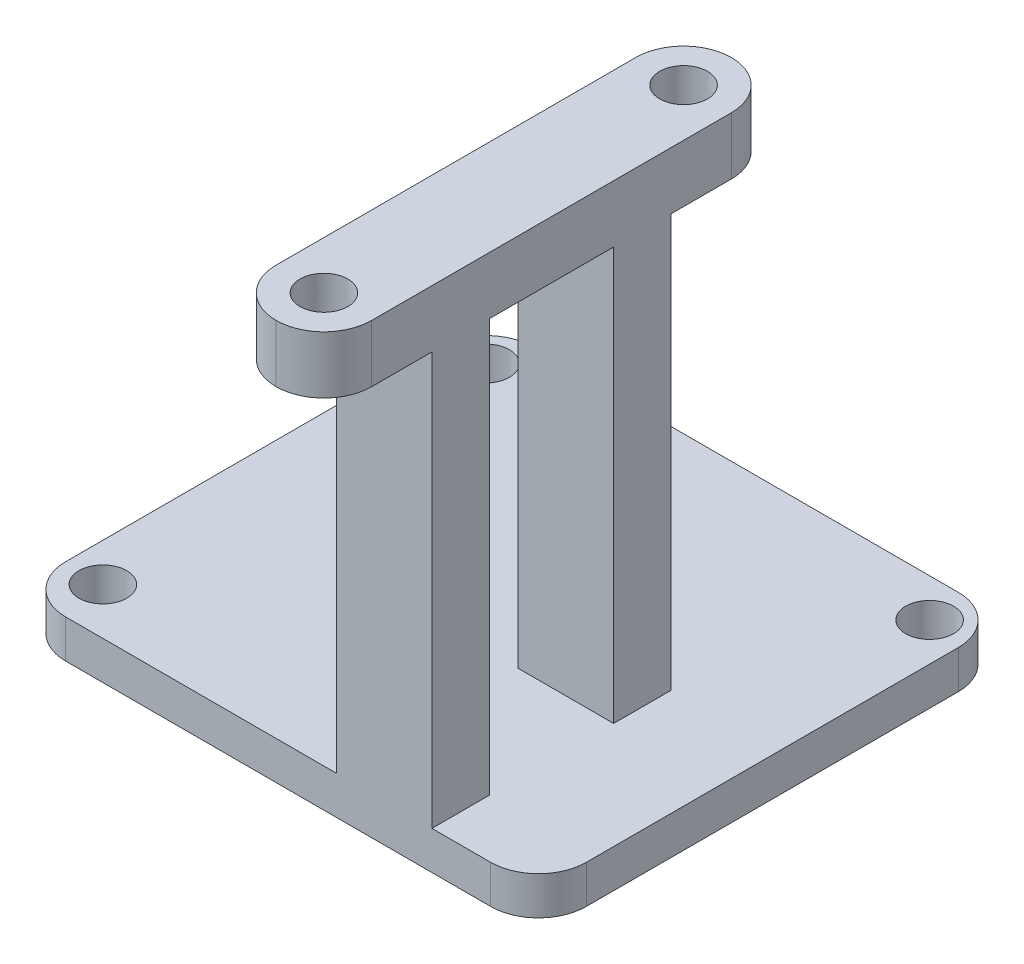
ISO-10303-21;
HEADER;
FILE_DESCRIPTION(('STEP AP214'),'2;1');
FILE_NAME('part.step','',(''),(''),'','','');
FILE_SCHEMA(('AUTOMOTIVE_DESIGN { 1 0 10303 214 1 1 1 1 }'));
ENDSEC;
DATA;
#1=APPLICATION_CONTEXT('core data for automotive mechanical design processes');
#2=APPLICATION_PROTOCOL_DEFINITION('international standard','automotive_design',2000,#1);
#3=PRODUCT_CONTEXT('',#1,'mechanical');
#4=PRODUCT('Part','Part','',(#3));
#5=PRODUCT_RELATED_PRODUCT_CATEGORY('part','',(#4));
#6=PRODUCT_DEFINITION_FORMATION('','',#4);
#7=PRODUCT_DEFINITION_CONTEXT('part definition',#1,'design');
#8=PRODUCT_DEFINITION('design','',#6,#7);
#9=PRODUCT_DEFINITION_SHAPE('','',#8);
#10=(LENGTH_UNIT() NAMED_UNIT(*) SI_UNIT(.MILLI.,.METRE.));
#11=(NAMED_UNIT(*) PLANE_ANGLE_UNIT() SI_UNIT($,.RADIAN.));
#12=(NAMED_UNIT(*) SI_UNIT($,.STERADIAN.) SOLID_ANGLE_UNIT());
#13=UNCERTAINTY_MEASURE_WITH_UNIT(LENGTH_MEASURE(1.E-05),#10,'distance_accuracy_value','');
#14=(GEOMETRIC_REPRESENTATION_CONTEXT(3) GLOBAL_UNCERTAINTY_ASSIGNED_CONTEXT((#13)) GLOBAL_UNIT_ASSIGNED_CONTEXT((#10,
#11,#12)) REPRESENTATION_CONTEXT('',''));
#15=CARTESIAN_POINT('',(0.,0.,0.));
#16=DIRECTION('',(0.,0.,1.));
#17=DIRECTION('',(1.,0.,0.));
#18=AXIS2_PLACEMENT_3D('',#15,#16,#17);
#19=CARTESIAN_POINT('',(-69.1242966,5.08,0.));
#20=DIRECTION('',(0.,-1.,0.));
#21=DIRECTION('',(0.,0.,-1.));
#22=AXIS2_PLACEMENT_3D('',#19,#20,#21);
#23=PLANE('',#22);
#24=DIRECTION('',(0.,0.,1.));
#25=VECTOR('',#24,1.);
#26=CARTESIAN_POINT('',(-61.4135805,5.08,0.));
#27=LINE('',#26,#25);
#28=CARTESIAN_POINT('',(-61.4135805,5.08,-0.706390719495832));
#29=VERTEX_POINT('',#28);
#30=CARTESIAN_POINT('',(-61.4135805,5.08,6.91360928050417));
#31=VERTEX_POINT('',#30);
#32=EDGE_CURVE('E225',#29,#31,#27,.T.);
#33=ORIENTED_EDGE('',*,*,#32,.F.);
#34=DIRECTION('',(1.,0.,0.));
#35=VECTOR('',#34,1.);
#36=CARTESIAN_POINT('',(-61.4135805,5.08,-0.706390719495832));
#37=LINE('',#36,#35);
#38=CARTESIAN_POINT('',(-48.7135805,5.08,-0.706390719495832));
#39=VERTEX_POINT('',#38);
#40=EDGE_CURVE('E219',#29,#39,#37,.T.);
#41=ORIENTED_EDGE('',*,*,#40,.T.);
#42=DIRECTION('',(0.,0.,1.));
#43=VECTOR('',#42,1.);
#44=CARTESIAN_POINT('',(-48.7135805,5.08,0.));
#45=LINE('',#44,#43);
#46=CARTESIAN_POINT('',(-48.7135805,5.08,6.91360928050417));
#47=VERTEX_POINT('',#46);
#48=EDGE_CURVE('E258',#39,#47,#45,.T.);
#49=ORIENTED_EDGE('',*,*,#48,.T.);
#50=DIRECTION('',(1.,0.,0.));
#51=VECTOR('',#50,1.);
#52=CARTESIAN_POINT('',(-61.4135805,5.08,6.91360928050417));
#53=LINE('',#52,#51);
#54=EDGE_CURVE('E294',#31,#47,#53,.T.);
#55=ORIENTED_EDGE('',*,*,#54,.F.);
#56=EDGE_LOOP('',(#33,#41,#49,#55));
#57=FACE_BOUND('',#56,.T.);
#58=CARTESIAN_POINT('',(-39.6421483,5.08,-25.9636092805042));
#59=DIRECTION('',(0.,-1.,0.));
#60=DIRECTION('',(0.,0.,1.));
#61=AXIS2_PLACEMENT_3D('',#58,#59,#60);
#62=CIRCLE('',#61,3.17499999999997);
#63=CARTESIAN_POINT('',(-39.6421483,5.08,-22.7886092805042));
#64=VERTEX_POINT('',#63);
#65=EDGE_CURVE('E316',#64,#64,#62,.T.);
#66=ORIENTED_EDGE('',*,*,#65,.T.);
#67=EDGE_LOOP('',(#66));
#68=FACE_BOUND('',#67,.T.);
#69=CARTESIAN_POINT('',(-98.6064449,5.08,-25.963609280505));
#70=DIRECTION('',(0.,-1.,0.));
#71=DIRECTION('',(0.,0.,1.));
#72=AXIS2_PLACEMENT_3D('',#69,#70,#71);
#73=CIRCLE('',#72,3.17499999999997);
#74=CARTESIAN_POINT('',(-98.6064449,5.08,-22.788609280505));
#75=VERTEX_POINT('',#74);
#76=EDGE_CURVE('E308',#75,#75,#73,.T.);
#77=ORIENTED_EDGE('',*,*,#76,.T.);
#78=EDGE_LOOP('',(#77));
#79=FACE_BOUND('',#78,.T.);
#80=CARTESIAN_POINT('',(-98.6064449000012,5.08,24.836390719495));
#81=DIRECTION('',(0.,-1.,0.));
#82=DIRECTION('',(0.,0.,1.));
#83=AXIS2_PLACEMENT_3D('',#80,#81,#82);
#84=CIRCLE('',#83,3.17499999999997);
#85=CARTESIAN_POINT('',(-98.6064449000012,5.08,28.011390719495));
#86=VERTEX_POINT('',#85);
#87=EDGE_CURVE('E300',#86,#86,#84,.T.);
#88=ORIENTED_EDGE('',*,*,#87,.T.);
#89=EDGE_LOOP('',(#88));
#90=FACE_BOUND('',#89,.T.);
#91=DIRECTION('',(0.,0.,-1.));
#92=VECTOR('',#91,1.);
#93=CARTESIAN_POINT('',(-103.6864449,5.08,-31.0436092805042));
#94=LINE('',#93,#92);
#95=CARTESIAN_POINT('',(-103.6864449,5.08,24.6936092805042));
#96=VERTEX_POINT('',#95);
#97=CARTESIAN_POINT('',(-103.6864449,5.08,-24.6936092805042));
#98=VERTEX_POINT('',#97);
#99=EDGE_CURVE('E334',#96,#98,#94,.T.);
#100=ORIENTED_EDGE('',*,*,#99,.F.);
#101=CARTESIAN_POINT('',(-97.3364449,5.08,24.6936092805042));
#102=DIRECTION('',(0.,1.,0.));
#103=DIRECTION('',(0.,0.,-1.));
#104=AXIS2_PLACEMENT_3D('',#101,#102,#103);
#105=CIRCLE('',#104,6.35);
#106=CARTESIAN_POINT('',(-97.3364449,5.08,31.0436092805042));
#107=VERTEX_POINT('',#106);
#108=EDGE_CURVE('E392',#107,#96,#105,.F.);
#109=ORIENTED_EDGE('',*,*,#108,.F.);
#110=DIRECTION('',(-1.,0.,0.));
#111=VECTOR('',#110,1.);
#112=CARTESIAN_POINT('',(-103.6864449,5.08,31.0436092805042));
#113=LINE('',#112,#111);
#114=CARTESIAN_POINT('',(-61.4135805,5.08,31.0436092805042));
#115=VERTEX_POINT('',#114);
#116=EDGE_CURVE('E328',#115,#107,#113,.T.);
#117=ORIENTED_EDGE('',*,*,#116,.F.);
#118=DIRECTION('',(0.,0.,-1.));
#119=VECTOR('',#118,1.);
#120=CARTESIAN_POINT('',(-61.4135805,5.08,0.));
#121=LINE('',#120,#119);
#122=CARTESIAN_POINT('',(-61.4135805,5.08,23.4236092805042));
#123=VERTEX_POINT('',#122);
#124=EDGE_CURVE('E238',#115,#123,#121,.T.);
#125=ORIENTED_EDGE('',*,*,#124,.T.);
#126=DIRECTION('',(1.,0.,0.));
#127=VECTOR('',#126,1.);
#128=CARTESIAN_POINT('',(-61.4135805,5.08,23.4236092805042));
#129=LINE('',#128,#127);
#130=CARTESIAN_POINT('',(-48.7135805,5.08,23.4236092805042));
#131=VERTEX_POINT('',#130);
#132=EDGE_CURVE('E282',#123,#131,#129,.T.);
#133=ORIENTED_EDGE('',*,*,#132,.T.);
#134=DIRECTION('',(0.,0.,-1.));
#135=VECTOR('',#134,1.);
#136=CARTESIAN_POINT('',(-48.7135805,5.08,0.));
#137=LINE('',#136,#135);
#138=CARTESIAN_POINT('',(-48.7135805,5.08,31.0436092805042));
#139=VERTEX_POINT('',#138);
#140=EDGE_CURVE('E269',#139,#131,#137,.T.);
#141=ORIENTED_EDGE('',*,*,#140,.F.);
#142=CARTESIAN_POINT('',(-40.9121483,5.08,31.0436092805042));
#143=VERTEX_POINT('',#142);
#144=EDGE_CURVE('E330',#143,#139,#113,.T.);
#145=ORIENTED_EDGE('',*,*,#144,.F.);
#146=CARTESIAN_POINT('',(-40.9121483,5.08,24.6936092805042));
#147=DIRECTION('',(0.,1.,0.));
#148=DIRECTION('',(0.,0.,-1.));
#149=AXIS2_PLACEMENT_3D('',#146,#147,#148);
#150=CIRCLE('',#149,6.35);
#151=CARTESIAN_POINT('',(-34.5621483,5.08,24.6936092805042));
#152=VERTEX_POINT('',#151);
#153=EDGE_CURVE('E388',#152,#143,#150,.F.);
#154=ORIENTED_EDGE('',*,*,#153,.F.);
#155=DIRECTION('',(0.,0.,1.));
#156=VECTOR('',#155,1.);
#157=CARTESIAN_POINT('',(-34.5621483,5.08,-31.0436092805042));
#158=LINE('',#157,#156);
#159=CARTESIAN_POINT('',(-34.5621483,5.08,-24.6936092805042));
#160=VERTEX_POINT('',#159);
#161=EDGE_CURVE('E324',#160,#152,#158,.T.);
#162=ORIENTED_EDGE('',*,*,#161,.F.);
#163=CARTESIAN_POINT('',(-40.9121483,5.08,-24.6936092805042));
#164=DIRECTION('',(0.,1.,0.));
#165=DIRECTION('',(0.,0.,-1.));
#166=AXIS2_PLACEMENT_3D('',#163,#164,#165);
#167=CIRCLE('',#166,6.35);
#168=CARTESIAN_POINT('',(-40.9121483,5.08,-31.0436092805042));
#169=VERTEX_POINT('',#168);
#170=EDGE_CURVE('E384',#169,#160,#167,.F.);
#171=ORIENTED_EDGE('',*,*,#170,.F.);
#172=DIRECTION('',(1.,0.,0.));
#173=VECTOR('',#172,1.);
#174=CARTESIAN_POINT('',(-103.6864449,5.08,-31.0436092805042));
#175=LINE('',#174,#173);
#176=CARTESIAN_POINT('',(-97.3364449,5.08,-31.0436092805042));
#177=VERTEX_POINT('',#176);
#178=EDGE_CURVE('E338',#177,#169,#175,.T.);
#179=ORIENTED_EDGE('',*,*,#178,.F.);
#180=CARTESIAN_POINT('',(-97.3364449,5.08,-24.6936092805042));
#181=DIRECTION('',(0.,1.,0.));
#182=DIRECTION('',(0.,0.,-1.));
#183=AXIS2_PLACEMENT_3D('',#180,#181,#182);
#184=CIRCLE('',#183,6.35);
#185=EDGE_CURVE('E396',#98,#177,#184,.F.);
#186=ORIENTED_EDGE('',*,*,#185,.F.);
#187=EDGE_LOOP('',(#100,#109,#117,#125,#133,#141,#145,#154,#162,#171,#179,#186));
#188=FACE_BOUND('',#187,.T.);
#189=ADVANCED_FACE('F49',(#57,#68,#79,#90,#188),#23,.F.);
#190=CARTESIAN_POINT('',(-69.1242966,0.,0.));
#191=DIRECTION('',(0.,-1.,0.));
#192=DIRECTION('',(0.,0.,-1.));
#193=AXIS2_PLACEMENT_3D('',#190,#191,#192);
#194=PLANE('',#193);
#195=CARTESIAN_POINT('',(-98.6064449,0.,-25.963609280505));
#196=DIRECTION('',(0.,-1.,0.));
#197=DIRECTION('',(0.,0.,1.));
#198=AXIS2_PLACEMENT_3D('',#195,#196,#197);
#199=CIRCLE('',#198,3.17499999999997);
#200=CARTESIAN_POINT('',(-98.6064449,0.,-22.788609280505));
#201=VERTEX_POINT('',#200);
#202=EDGE_CURVE('E304',#201,#201,#199,.T.);
#203=ORIENTED_EDGE('',*,*,#202,.F.);
#204=EDGE_LOOP('',(#203));
#205=FACE_BOUND('',#204,.T.);
#206=DIRECTION('',(1.,0.,0.));
#207=VECTOR('',#206,1.);
#208=CARTESIAN_POINT('',(-103.6864449,0.,-31.0436092805042));
#209=LINE('',#208,#207);
#210=CARTESIAN_POINT('',(-97.3364449,0.,-31.0436092805042));
#211=VERTEX_POINT('',#210);
#212=CARTESIAN_POINT('',(-40.9121483,0.,-31.0436092805042));
#213=VERTEX_POINT('',#212);
#214=EDGE_CURVE('E329',#211,#213,#209,.T.);
#215=ORIENTED_EDGE('',*,*,#214,.T.);
#216=CARTESIAN_POINT('',(-40.9121483,0.,-24.6936092805042));
#217=DIRECTION('',(0.,1.,0.));
#218=DIRECTION('',(0.,0.,-1.));
#219=AXIS2_PLACEMENT_3D('',#216,#217,#218);
#220=CIRCLE('',#219,6.35);
#221=CARTESIAN_POINT('',(-34.5621483,0.,-24.6936092805042));
#222=VERTEX_POINT('',#221);
#223=EDGE_CURVE('E362',#222,#213,#220,.T.);
#224=ORIENTED_EDGE('',*,*,#223,.F.);
#225=DIRECTION('',(0.,0.,1.));
#226=VECTOR('',#225,1.);
#227=CARTESIAN_POINT('',(-34.5621483,0.,-31.0436092805042));
#228=LINE('',#227,#226);
#229=CARTESIAN_POINT('',(-34.5621483,0.,24.6936092805042));
#230=VERTEX_POINT('',#229);
#231=EDGE_CURVE('E320',#222,#230,#228,.T.);
#232=ORIENTED_EDGE('',*,*,#231,.T.);
#233=CARTESIAN_POINT('',(-40.9121483,0.,24.6936092805042));
#234=DIRECTION('',(0.,1.,0.));
#235=DIRECTION('',(0.,0.,-1.));
#236=AXIS2_PLACEMENT_3D('',#233,#234,#235);
#237=CIRCLE('',#236,6.35);
#238=CARTESIAN_POINT('',(-40.9121483,0.,31.0436092805042));
#239=VERTEX_POINT('',#238);
#240=EDGE_CURVE('E366',#239,#230,#237,.T.);
#241=ORIENTED_EDGE('',*,*,#240,.F.);
#242=DIRECTION('',(-1.,0.,0.));
#243=VECTOR('',#242,1.);
#244=CARTESIAN_POINT('',(-103.6864449,0.,31.0436092805042));
#245=LINE('',#244,#243);
#246=CARTESIAN_POINT('',(-97.3364449,0.,31.0436092805042));
#247=VERTEX_POINT('',#246);
#248=EDGE_CURVE('E346',#239,#247,#245,.T.);
#249=ORIENTED_EDGE('',*,*,#248,.T.);
#250=CARTESIAN_POINT('',(-97.3364449,0.,24.6936092805042));
#251=DIRECTION('',(0.,1.,0.));
#252=DIRECTION('',(0.,0.,-1.));
#253=AXIS2_PLACEMENT_3D('',#250,#251,#252);
#254=CIRCLE('',#253,6.35);
#255=CARTESIAN_POINT('',(-103.6864449,0.,24.6936092805042));
#256=VERTEX_POINT('',#255);
#257=EDGE_CURVE('E370',#256,#247,#254,.T.);
#258=ORIENTED_EDGE('',*,*,#257,.F.);
#259=DIRECTION('',(0.,0.,-1.));
#260=VECTOR('',#259,1.);
#261=CARTESIAN_POINT('',(-103.6864449,0.,-31.0436092805042));
#262=LINE('',#261,#260);
#263=CARTESIAN_POINT('',(-103.6864449,0.,-24.6936092805042));
#264=VERTEX_POINT('',#263);
#265=EDGE_CURVE('E350',#256,#264,#262,.T.);
#266=ORIENTED_EDGE('',*,*,#265,.T.);
#267=CARTESIAN_POINT('',(-97.3364449,0.,-24.6936092805042));
#268=DIRECTION('',(0.,1.,0.));
#269=DIRECTION('',(0.,0.,-1.));
#270=AXIS2_PLACEMENT_3D('',#267,#268,#269);
#271=CIRCLE('',#270,6.35);
#272=EDGE_CURVE('E374',#211,#264,#271,.T.);
#273=ORIENTED_EDGE('',*,*,#272,.F.);
#274=EDGE_LOOP('',(#215,#224,#232,#241,#249,#258,#266,#273));
#275=FACE_BOUND('',#274,.T.);
#276=CARTESIAN_POINT('',(-39.6421483,0.,-25.9636092805042));
#277=DIRECTION('',(0.,-1.,0.));
#278=DIRECTION('',(0.,0.,1.));
#279=AXIS2_PLACEMENT_3D('',#276,#277,#278);
#280=CIRCLE('',#279,3.17499999999997);
#281=CARTESIAN_POINT('',(-39.6421483,0.,-22.7886092805042));
#282=VERTEX_POINT('',#281);
#283=EDGE_CURVE('E312',#282,#282,#280,.T.);
#284=ORIENTED_EDGE('',*,*,#283,.F.);
#285=EDGE_LOOP('',(#284));
#286=FACE_BOUND('',#285,.T.);
#287=CARTESIAN_POINT('',(-98.6064449000012,0.,24.836390719495));
#288=DIRECTION('',(0.,-1.,0.));
#289=DIRECTION('',(0.,0.,1.));
#290=AXIS2_PLACEMENT_3D('',#287,#288,#289);
#291=CIRCLE('',#290,3.17499999999997);
#292=CARTESIAN_POINT('',(-98.6064449000012,0.,28.011390719495));
#293=VERTEX_POINT('',#292);
#294=EDGE_CURVE('E281',#293,#293,#291,.T.);
#295=ORIENTED_EDGE('',*,*,#294,.F.);
#296=EDGE_LOOP('',(#295));
#297=FACE_BOUND('',#296,.T.);
#298=ADVANCED_FACE('F520',(#205,#275,#286,#297),#194,.T.);
#299=CARTESIAN_POINT('',(-34.5621483,5.08,-31.0436092805042));
#300=DIRECTION('',(-1.,0.,0.));
#301=DIRECTION('',(0.,0.,-1.));
#302=AXIS2_PLACEMENT_3D('',#299,#300,#301);
#303=PLANE('',#302);
#304=ORIENTED_EDGE('',*,*,#231,.F.);
#305=DIRECTION('',(0.,-1.,0.));
#306=VECTOR('',#305,1.);
#307=CARTESIAN_POINT('',(-34.5621483,5.08,-24.6936092805042));
#308=LINE('',#307,#306);
#309=EDGE_CURVE('E406',#160,#222,#308,.T.);
#310=ORIENTED_EDGE('',*,*,#309,.F.);
#311=ORIENTED_EDGE('',*,*,#161,.T.);
#312=DIRECTION('',(0.,-1.,0.));
#313=VECTOR('',#312,1.);
#314=CARTESIAN_POINT('',(-34.5621483,5.08,24.6936092805042));
#315=LINE('',#314,#313);
#316=EDGE_CURVE('E409',#230,#152,#315,.F.);
#317=ORIENTED_EDGE('',*,*,#316,.F.);
#318=EDGE_LOOP('',(#304,#310,#311,#317));
#319=FACE_BOUND('',#318,.T.);
#320=ADVANCED_FACE('F526',(#319),#303,.F.);
#321=CARTESIAN_POINT('',(-103.6864449,5.08,31.0436092805042));
#322=DIRECTION('',(0.,0.,-1.));
#323=DIRECTION('',(1.,0.,0.));
#324=AXIS2_PLACEMENT_3D('',#321,#322,#323);
#325=PLANE('',#324);
#326=ORIENTED_EDGE('',*,*,#248,.F.);
#327=DIRECTION('',(0.,-1.,0.));
#328=VECTOR('',#327,1.);
#329=CARTESIAN_POINT('',(-40.9121483,5.08,31.0436092805042));
#330=LINE('',#329,#328);
#331=EDGE_CURVE('E400',#143,#239,#330,.T.);
#332=ORIENTED_EDGE('',*,*,#331,.F.);
#333=ORIENTED_EDGE('',*,*,#144,.T.);
#334=DIRECTION('',(0.,1.,0.));
#335=VECTOR('',#334,1.);
#336=CARTESIAN_POINT('',(-48.7135805,0.,31.0436092805042));
#337=LINE('',#336,#335);
#338=CARTESIAN_POINT('',(-48.7135805,59.8643964,31.0436092805042));
#339=VERTEX_POINT('',#338);
#340=EDGE_CURVE('E273',#139,#339,#337,.T.);
#341=ORIENTED_EDGE('',*,*,#340,.T.);
#342=DIRECTION('',(1.,0.,0.));
#343=VECTOR('',#342,1.);
#344=CARTESIAN_POINT('',(-61.4135805,59.8643964,31.0436092805042));
#345=LINE('',#344,#343);
#346=CARTESIAN_POINT('',(-61.4135805,59.8643964,31.0436092805042));
#347=VERTEX_POINT('',#346);
#348=EDGE_CURVE('E277',#347,#339,#345,.T.);
#349=ORIENTED_EDGE('',*,*,#348,.F.);
#350=DIRECTION('',(0.,1.,0.));
#351=VECTOR('',#350,1.);
#352=CARTESIAN_POINT('',(-61.4135805,0.,31.0436092805042));
#353=LINE('',#352,#351);
#354=EDGE_CURVE('E242',#115,#347,#353,.T.);
#355=ORIENTED_EDGE('',*,*,#354,.F.);
#356=ORIENTED_EDGE('',*,*,#116,.T.);
#357=DIRECTION('',(0.,-1.,0.));
#358=VECTOR('',#357,1.);
#359=CARTESIAN_POINT('',(-97.3364449,5.08,31.0436092805042));
#360=LINE('',#359,#358);
#361=EDGE_CURVE('E403',#247,#107,#360,.F.);
#362=ORIENTED_EDGE('',*,*,#361,.F.);
#363=EDGE_LOOP('',(#326,#332,#333,#341,#349,#355,#356,#362));
#364=FACE_BOUND('',#363,.T.);
#365=ADVANCED_FACE('F541',(#364),#325,.F.);
#366=CARTESIAN_POINT('',(-103.6864449,5.08,-31.0436092805042));
#367=DIRECTION('',(1.,0.,0.));
#368=DIRECTION('',(0.,0.,1.));
#369=AXIS2_PLACEMENT_3D('',#366,#367,#368);
#370=PLANE('',#369);
#371=ORIENTED_EDGE('',*,*,#265,.F.);
#372=DIRECTION('',(0.,-1.,0.));
#373=VECTOR('',#372,1.);
#374=CARTESIAN_POINT('',(-103.6864449,5.08,24.6936092805042));
#375=LINE('',#374,#373);
#376=EDGE_CURVE('E378',#96,#256,#375,.T.);
#377=ORIENTED_EDGE('',*,*,#376,.F.);
#378=ORIENTED_EDGE('',*,*,#99,.T.);
#379=DIRECTION('',(0.,-1.,0.));
#380=VECTOR('',#379,1.);
#381=CARTESIAN_POINT('',(-103.6864449,5.08,-24.6936092805042));
#382=LINE('',#381,#380);
#383=EDGE_CURVE('E381',#264,#98,#382,.F.);
#384=ORIENTED_EDGE('',*,*,#383,.F.);
#385=EDGE_LOOP('',(#371,#377,#378,#384));
#386=FACE_BOUND('',#385,.T.);
#387=ADVANCED_FACE('F537',(#386),#370,.F.);
#388=CARTESIAN_POINT('',(-103.6864449,5.08,-31.0436092805042));
#389=DIRECTION('',(0.,0.,1.));
#390=DIRECTION('',(-1.,0.,0.));
#391=AXIS2_PLACEMENT_3D('',#388,#389,#390);
#392=PLANE('',#391);
#393=ORIENTED_EDGE('',*,*,#178,.T.);
#394=DIRECTION('',(0.,-1.,0.));
#395=VECTOR('',#394,1.);
#396=CARTESIAN_POINT('',(-40.9121483,5.08,-31.0436092805042));
#397=LINE('',#396,#395);
#398=EDGE_CURVE('E342',#213,#169,#397,.F.);
#399=ORIENTED_EDGE('',*,*,#398,.F.);
#400=ORIENTED_EDGE('',*,*,#214,.F.);
#401=DIRECTION('',(0.,-1.,0.));
#402=VECTOR('',#401,1.);
#403=CARTESIAN_POINT('',(-97.3364449,5.08,-31.0436092805042));
#404=LINE('',#403,#402);
#405=EDGE_CURVE('E359',#177,#211,#404,.T.);
#406=ORIENTED_EDGE('',*,*,#405,.F.);
#407=EDGE_LOOP('',(#393,#399,#400,#406));
#408=FACE_BOUND('',#407,.T.);
#409=ADVANCED_FACE('F534',(#408),#392,.F.);
#410=CARTESIAN_POINT('',(-39.6421483,5.08,-25.9636092805042));
#411=DIRECTION('',(0.,-1.,0.));
#412=DIRECTION('',(0.,0.,-1.));
#413=AXIS2_PLACEMENT_3D('',#410,#411,#412);
#414=CYLINDRICAL_SURFACE('',#413,3.17499999999997);
#415=ORIENTED_EDGE('',*,*,#65,.F.);
#416=EDGE_LOOP('',(#415));
#417=FACE_BOUND('',#416,.T.);
#418=ORIENTED_EDGE('',*,*,#283,.T.);
#419=EDGE_LOOP('',(#418));
#420=FACE_BOUND('',#419,.T.);
#421=ADVANCED_FACE('F531',(#417,#420),#414,.F.);
#422=CARTESIAN_POINT('',(-98.6064449,5.08,-25.963609280505));
#423=DIRECTION('',(0.,-1.,0.));
#424=DIRECTION('',(0.,0.,-1.));
#425=AXIS2_PLACEMENT_3D('',#422,#423,#424);
#426=CYLINDRICAL_SURFACE('',#425,3.17499999999997);
#427=ORIENTED_EDGE('',*,*,#76,.F.);
#428=EDGE_LOOP('',(#427));
#429=FACE_BOUND('',#428,.T.);
#430=ORIENTED_EDGE('',*,*,#202,.T.);
#431=EDGE_LOOP('',(#430));
#432=FACE_BOUND('',#431,.T.);
#433=ADVANCED_FACE('F692',(#429,#432),#426,.F.);
#434=CARTESIAN_POINT('',(-98.6064449000012,5.08,24.836390719495));
#435=DIRECTION('',(0.,-1.,0.));
#436=DIRECTION('',(0.,0.,-1.));
#437=AXIS2_PLACEMENT_3D('',#434,#435,#436);
#438=CYLINDRICAL_SURFACE('',#437,3.17499999999997);
#439=ORIENTED_EDGE('',*,*,#87,.F.);
#440=EDGE_LOOP('',(#439));
#441=FACE_BOUND('',#440,.T.);
#442=ORIENTED_EDGE('',*,*,#294,.T.);
#443=EDGE_LOOP('',(#442));
#444=FACE_BOUND('',#443,.T.);
#445=ADVANCED_FACE('F683',(#441,#444),#438,.F.);
#446=CARTESIAN_POINT('',(-61.4135805,59.8643964,0.));
#447=DIRECTION('',(0.,-1.,0.));
#448=DIRECTION('',(0.,0.,-1.));
#449=AXIS2_PLACEMENT_3D('',#446,#447,#448);
#450=PLANE('',#449);
#451=CARTESIAN_POINT('',(-55.0635805,59.8643964,39.0348810805042));
#452=DIRECTION('',(0.,1.,0.));
#453=DIRECTION('',(0.,0.,-1.));
#454=AXIS2_PLACEMENT_3D('',#451,#452,#453);
#455=CIRCLE('',#454,3.175);
#456=CARTESIAN_POINT('',(-55.0635805,59.8643964,35.8598810805042));
#457=VERTEX_POINT('',#456);
#458=EDGE_CURVE('E461',#457,#457,#455,.T.);
#459=ORIENTED_EDGE('',*,*,#458,.T.);
#460=EDGE_LOOP('',(#459));
#461=FACE_BOUND('',#460,.T.);
#462=CARTESIAN_POINT('',(-55.0635805,59.8643964,39.0348810805042));
#463=DIRECTION('',(0.,1.,0.));
#464=DIRECTION('',(0.,0.,-1.));
#465=AXIS2_PLACEMENT_3D('',#462,#463,#464);
#466=CIRCLE('',#465,6.35);
#467=CARTESIAN_POINT('',(-61.4135805,59.8643964,39.0348810805042));
#468=VERTEX_POINT('',#467);
#469=CARTESIAN_POINT('',(-55.0635805,59.8643964,45.3848810805042));
#470=VERTEX_POINT('',#469);
#471=EDGE_CURVE('E412',#468,#470,#466,.T.);
#472=ORIENTED_EDGE('',*,*,#471,.F.);
#473=DIRECTION('',(0.,0.,1.));
#474=VECTOR('',#473,1.);
#475=CARTESIAN_POINT('',(-61.4135805,59.8643964,0.));
#476=LINE('',#475,#474);
#477=EDGE_CURVE('E208',#347,#468,#476,.T.);
#478=ORIENTED_EDGE('',*,*,#477,.F.);
#479=ORIENTED_EDGE('',*,*,#348,.T.);
#480=DIRECTION('',(0.,0.,1.));
#481=VECTOR('',#480,1.);
#482=CARTESIAN_POINT('',(-48.7135805,59.8643964,0.));
#483=LINE('',#482,#481);
#484=CARTESIAN_POINT('',(-48.7135805,59.8643964,39.0348810805042));
#485=VERTEX_POINT('',#484);
#486=EDGE_CURVE('E254',#339,#485,#483,.T.);
#487=ORIENTED_EDGE('',*,*,#486,.T.);
#488=CARTESIAN_POINT('',(-55.0635805,59.8643964,39.0348810805042));
#489=DIRECTION('',(0.,1.,0.));
#490=DIRECTION('',(0.,0.,-1.));
#491=AXIS2_PLACEMENT_3D('',#488,#489,#490);
#492=CIRCLE('',#491,6.35);
#493=EDGE_CURVE('E416',#470,#485,#492,.T.);
#494=ORIENTED_EDGE('',*,*,#493,.F.);
#495=EDGE_LOOP('',(#472,#478,#479,#487,#494));
#496=FACE_BOUND('',#495,.T.);
#497=ADVANCED_FACE('F503',(#461,#496),#450,.T.);
#498=CARTESIAN_POINT('',(-61.4135805,0.,23.4236092805042));
#499=DIRECTION('',(0.,0.,1.));
#500=DIRECTION('',(-1.,0.,0.));
#501=AXIS2_PLACEMENT_3D('',#498,#499,#500);
#502=PLANE('',#501);
#503=DIRECTION('',(0.,1.,0.));
#504=VECTOR('',#503,1.);
#505=CARTESIAN_POINT('',(-48.7135805,0.,23.4236092805042));
#506=LINE('',#505,#504);
#507=CARTESIAN_POINT('',(-48.7135805,59.8643964,23.4236092805042));
#508=VERTEX_POINT('',#507);
#509=EDGE_CURVE('E265',#131,#508,#506,.T.);
#510=ORIENTED_EDGE('',*,*,#509,.F.);
#511=ORIENTED_EDGE('',*,*,#132,.F.);
#512=DIRECTION('',(0.,1.,0.));
#513=VECTOR('',#512,1.);
#514=CARTESIAN_POINT('',(-61.4135805,0.,23.4236092805042));
#515=LINE('',#514,#513);
#516=CARTESIAN_POINT('',(-61.4135805,59.8643964,23.4236092805042));
#517=VERTEX_POINT('',#516);
#518=EDGE_CURVE('E234',#123,#517,#515,.T.);
#519=ORIENTED_EDGE('',*,*,#518,.T.);
#520=DIRECTION('',(1.,0.,0.));
#521=VECTOR('',#520,1.);
#522=CARTESIAN_POINT('',(-61.4135805,59.8643964,23.4236092805042));
#523=LINE('',#522,#521);
#524=EDGE_CURVE('E286',#517,#508,#523,.T.);
#525=ORIENTED_EDGE('',*,*,#524,.T.);
#526=EDGE_LOOP('',(#510,#511,#519,#525));
#527=FACE_BOUND('',#526,.T.);
#528=ADVANCED_FACE('F487',(#527),#502,.F.);
#529=CARTESIAN_POINT('',(-48.7135805,59.8643964,6.91360928050417));
#530=VERTEX_POINT('',#529);
#531=EDGE_CURVE('E255',#530,#508,#483,.T.);
#532=ORIENTED_EDGE('',*,*,#531,.T.);
#533=ORIENTED_EDGE('',*,*,#524,.F.);
#534=CARTESIAN_POINT('',(-61.4135805,59.8643964,6.91360928050417));
#535=VERTEX_POINT('',#534);
#536=EDGE_CURVE('E209',#535,#517,#476,.T.);
#537=ORIENTED_EDGE('',*,*,#536,.F.);
#538=DIRECTION('',(1.,0.,0.));
#539=VECTOR('',#538,1.);
#540=CARTESIAN_POINT('',(-61.4135805,59.8643964,6.91360928050417));
#541=LINE('',#540,#539);
#542=EDGE_CURVE('E290',#535,#530,#541,.T.);
#543=ORIENTED_EDGE('',*,*,#542,.T.);
#544=EDGE_LOOP('',(#532,#533,#537,#543));
#545=FACE_BOUND('',#544,.T.);
#546=ADVANCED_FACE('F482',(#545),#450,.T.);
#547=CARTESIAN_POINT('',(-61.4135805,0.,6.91360928050417));
#548=DIRECTION('',(0.,0.,1.));
#549=DIRECTION('',(-1.,0.,0.));
#550=AXIS2_PLACEMENT_3D('',#547,#548,#549);
#551=PLANE('',#550);
#552=DIRECTION('',(0.,1.,0.));
#553=VECTOR('',#552,1.);
#554=CARTESIAN_POINT('',(-48.7135805,0.,6.91360928050417));
#555=LINE('',#554,#553);
#556=EDGE_CURVE('E262',#47,#530,#555,.T.);
#557=ORIENTED_EDGE('',*,*,#556,.T.);
#558=ORIENTED_EDGE('',*,*,#542,.F.);
#559=DIRECTION('',(0.,1.,0.));
#560=VECTOR('',#559,1.);
#561=CARTESIAN_POINT('',(-61.4135805,0.,6.91360928050417));
#562=LINE('',#561,#560);
#563=EDGE_CURVE('E228',#31,#535,#562,.T.);
#564=ORIENTED_EDGE('',*,*,#563,.F.);
#565=ORIENTED_EDGE('',*,*,#54,.T.);
#566=EDGE_LOOP('',(#557,#558,#564,#565));
#567=FACE_BOUND('',#566,.T.);
#568=ADVANCED_FACE('F651',(#567),#551,.T.);
#569=CARTESIAN_POINT('',(-61.4135805,0.,-0.706390719495832));
#570=DIRECTION('',(0.,0.,1.));
#571=DIRECTION('',(0.,-1.,0.));
#572=AXIS2_PLACEMENT_3D('',#569,#570,#571);
#573=PLANE('',#572);
#574=DIRECTION('',(0.,1.,0.));
#575=VECTOR('',#574,1.);
#576=CARTESIAN_POINT('',(-48.7135805,0.,-0.706390719495832));
#577=LINE('',#576,#575);
#578=CARTESIAN_POINT('',(-48.7135805,59.8643964,-0.706390719495833));
#579=VERTEX_POINT('',#578);
#580=EDGE_CURVE('E253',#39,#579,#577,.T.);
#581=ORIENTED_EDGE('',*,*,#580,.F.);
#582=ORIENTED_EDGE('',*,*,#40,.F.);
#583=DIRECTION('',(0.,1.,0.));
#584=VECTOR('',#583,1.);
#585=CARTESIAN_POINT('',(-61.4135805,0.,-0.706390719495832));
#586=LINE('',#585,#584);
#587=CARTESIAN_POINT('',(-61.4135805,59.8643964,-0.706390719495833));
#588=VERTEX_POINT('',#587);
#589=EDGE_CURVE('E201',#29,#588,#586,.T.);
#590=ORIENTED_EDGE('',*,*,#589,.T.);
#591=DIRECTION('',(1.,0.,0.));
#592=VECTOR('',#591,1.);
#593=CARTESIAN_POINT('',(-61.4135805,59.8643964,-0.706390719495833));
#594=LINE('',#593,#592);
#595=EDGE_CURVE('E211',#588,#579,#594,.T.);
#596=ORIENTED_EDGE('',*,*,#595,.T.);
#597=EDGE_LOOP('',(#581,#582,#590,#596));
#598=FACE_BOUND('',#597,.T.);
#599=ADVANCED_FACE('F221',(#598),#573,.F.);
#600=CARTESIAN_POINT('',(-55.0635805,59.8643964,-8.71711891949583));
#601=DIRECTION('',(0.,1.,0.));
#602=DIRECTION('',(0.,0.,-1.));
#603=AXIS2_PLACEMENT_3D('',#600,#601,#602);
#604=CIRCLE('',#603,3.175);
#605=CARTESIAN_POINT('',(-55.0635805,59.8643964,-11.8921189194958));
#606=VERTEX_POINT('',#605);
#607=EDGE_CURVE('E250',#606,#606,#604,.T.);
#608=ORIENTED_EDGE('',*,*,#607,.T.);
#609=EDGE_LOOP('',(#608));
#610=FACE_BOUND('',#609,.T.);
#611=CARTESIAN_POINT('',(-48.7135805,59.8643964,-8.71711891949583));
#612=VERTEX_POINT('',#611);
#613=EDGE_CURVE('E215',#612,#579,#483,.T.);
#614=ORIENTED_EDGE('',*,*,#613,.T.);
#615=ORIENTED_EDGE('',*,*,#595,.F.);
#616=CARTESIAN_POINT('',(-61.4135805,59.8643964,-8.71711891949583));
#617=VERTEX_POINT('',#616);
#618=EDGE_CURVE('E196',#617,#588,#476,.T.);
#619=ORIENTED_EDGE('',*,*,#618,.F.);
#620=CARTESIAN_POINT('',(-55.0635805,59.8643964,-8.71711891949583));
#621=DIRECTION('',(0.,1.,0.));
#622=DIRECTION('',(0.,0.,-1.));
#623=AXIS2_PLACEMENT_3D('',#620,#621,#622);
#624=CIRCLE('',#623,6.35);
#625=CARTESIAN_POINT('',(-55.0635805,59.8643964,-15.0671189194958));
#626=VERTEX_POINT('',#625);
#627=EDGE_CURVE('E441',#626,#617,#624,.T.);
#628=ORIENTED_EDGE('',*,*,#627,.F.);
#629=CARTESIAN_POINT('',(-55.0635805,59.8643964,-8.71711891949583));
#630=DIRECTION('',(0.,1.,0.));
#631=DIRECTION('',(0.,0.,-1.));
#632=AXIS2_PLACEMENT_3D('',#629,#630,#631);
#633=CIRCLE('',#632,6.35);
#634=EDGE_CURVE('E444',#612,#626,#633,.T.);
#635=ORIENTED_EDGE('',*,*,#634,.F.);
#636=EDGE_LOOP('',(#614,#615,#619,#628,#635));
#637=FACE_BOUND('',#636,.T.);
#638=ADVANCED_FACE('F212',(#610,#637),#450,.T.);
#639=CARTESIAN_POINT('',(-61.4135805,67.4843964,0.));
#640=DIRECTION('',(0.,-1.,0.));
#641=DIRECTION('',(0.,0.,-1.));
#642=AXIS2_PLACEMENT_3D('',#639,#640,#641);
#643=PLANE('',#642);
#644=CARTESIAN_POINT('',(-55.0635805,67.4843964,-8.71711891949583));
#645=DIRECTION('',(0.,-1.,0.));
#646=DIRECTION('',(0.,0.,1.));
#647=AXIS2_PLACEMENT_3D('',#644,#645,#646);
#648=CIRCLE('',#647,3.175);
#649=CARTESIAN_POINT('',(-55.0635805,67.4843964,-5.54211891949583));
#650=VERTEX_POINT('',#649);
#651=EDGE_CURVE('E455',#650,#650,#648,.T.);
#652=ORIENTED_EDGE('',*,*,#651,.T.);
#653=EDGE_LOOP('',(#652));
#654=FACE_BOUND('',#653,.T.);
#655=CARTESIAN_POINT('',(-55.0635805,67.4843964,39.0348810805042));
#656=DIRECTION('',(0.,-1.,0.));
#657=DIRECTION('',(0.,0.,1.));
#658=AXIS2_PLACEMENT_3D('',#655,#656,#657);
#659=CIRCLE('',#658,3.175);
#660=CARTESIAN_POINT('',(-55.0635805,67.4843964,42.2098810805042));
#661=VERTEX_POINT('',#660);
#662=EDGE_CURVE('E450',#661,#661,#659,.T.);
#663=ORIENTED_EDGE('',*,*,#662,.T.);
#664=EDGE_LOOP('',(#663));
#665=FACE_BOUND('',#664,.T.);
#666=CARTESIAN_POINT('',(-55.0635805,67.4843964,-8.71711891949583));
#667=DIRECTION('',(0.,1.,0.));
#668=DIRECTION('',(0.,0.,-1.));
#669=AXIS2_PLACEMENT_3D('',#666,#667,#668);
#670=CIRCLE('',#669,6.35);
#671=CARTESIAN_POINT('',(-61.4135805,67.4843964,-8.71711891949583));
#672=VERTEX_POINT('',#671);
#673=CARTESIAN_POINT('',(-55.0635805,67.4843964,-15.0671189194958));
#674=VERTEX_POINT('',#673);
#675=EDGE_CURVE('E434',#672,#674,#670,.F.);
#676=ORIENTED_EDGE('',*,*,#675,.F.);
#677=DIRECTION('',(0.,0.,1.));
#678=VECTOR('',#677,1.);
#679=CARTESIAN_POINT('',(-61.4135805,67.4843964,0.));
#680=LINE('',#679,#678);
#681=CARTESIAN_POINT('',(-61.4135805,67.4843964,39.0348810805042));
#682=VERTEX_POINT('',#681);
#683=EDGE_CURVE('E206',#672,#682,#680,.T.);
#684=ORIENTED_EDGE('',*,*,#683,.T.);
#685=CARTESIAN_POINT('',(-55.0635805,67.4843964,39.0348810805042));
#686=DIRECTION('',(0.,1.,0.));
#687=DIRECTION('',(0.,0.,-1.));
#688=AXIS2_PLACEMENT_3D('',#685,#686,#687);
#689=CIRCLE('',#688,6.35);
#690=CARTESIAN_POINT('',(-55.0635805,67.4843964,45.3848810805042));
#691=VERTEX_POINT('',#690);
#692=EDGE_CURVE('E426',#691,#682,#689,.F.);
#693=ORIENTED_EDGE('',*,*,#692,.F.);
#694=CARTESIAN_POINT('',(-55.0635805,67.4843964,39.0348810805042));
#695=DIRECTION('',(0.,1.,0.));
#696=DIRECTION('',(0.,0.,-1.));
#697=AXIS2_PLACEMENT_3D('',#694,#695,#696);
#698=CIRCLE('',#697,6.35);
#699=CARTESIAN_POINT('',(-48.7135805,67.4843964,39.0348810805042));
#700=VERTEX_POINT('',#699);
#701=EDGE_CURVE('E430',#700,#691,#698,.F.);
#702=ORIENTED_EDGE('',*,*,#701,.F.);
#703=DIRECTION('',(0.,0.,1.));
#704=VECTOR('',#703,1.);
#705=CARTESIAN_POINT('',(-48.7135805,67.4843964,0.));
#706=LINE('',#705,#704);
#707=CARTESIAN_POINT('',(-48.7135805,67.4843964,-8.71711891949583));
#708=VERTEX_POINT('',#707);
#709=EDGE_CURVE('E246',#708,#700,#706,.T.);
#710=ORIENTED_EDGE('',*,*,#709,.F.);
#711=CARTESIAN_POINT('',(-55.0635805,67.4843964,-8.71711891949583));
#712=DIRECTION('',(0.,1.,0.));
#713=DIRECTION('',(0.,0.,-1.));
#714=AXIS2_PLACEMENT_3D('',#711,#712,#713);
#715=CIRCLE('',#714,6.35);
#716=EDGE_CURVE('E437',#674,#708,#715,.F.);
#717=ORIENTED_EDGE('',*,*,#716,.F.);
#718=EDGE_LOOP('',(#676,#684,#693,#702,#710,#717));
#719=FACE_BOUND('',#718,.T.);
#720=ADVANCED_FACE('F506',(#654,#665,#719),#643,.F.);
#721=CARTESIAN_POINT('',(-61.4135805,0.,0.));
#722=DIRECTION('',(1.,0.,0.));
#723=DIRECTION('',(0.,0.,1.));
#724=AXIS2_PLACEMENT_3D('',#721,#722,#723);
#725=PLANE('',#724);
#726=ORIENTED_EDGE('',*,*,#618,.T.);
#727=ORIENTED_EDGE('',*,*,#589,.F.);
#728=ORIENTED_EDGE('',*,*,#32,.T.);
#729=ORIENTED_EDGE('',*,*,#563,.T.);
#730=ORIENTED_EDGE('',*,*,#536,.T.);
#731=ORIENTED_EDGE('',*,*,#518,.F.);
#732=ORIENTED_EDGE('',*,*,#124,.F.);
#733=ORIENTED_EDGE('',*,*,#354,.T.);
#734=ORIENTED_EDGE('',*,*,#477,.T.);
#735=DIRECTION('',(0.,-1.,0.));
#736=VECTOR('',#735,1.);
#737=CARTESIAN_POINT('',(-61.4135805,0.,39.0348810805041));
#738=LINE('',#737,#736);
#739=EDGE_CURVE('E59',#682,#468,#738,.T.);
#740=ORIENTED_EDGE('',*,*,#739,.F.);
#741=ORIENTED_EDGE('',*,*,#683,.F.);
#742=DIRECTION('',(0.,-1.,0.));
#743=VECTOR('',#742,1.);
#744=CARTESIAN_POINT('',(-61.4135805,67.4843964,-8.71711891949583));
#745=LINE('',#744,#743);
#746=EDGE_CURVE('E11',#617,#672,#745,.F.);
#747=ORIENTED_EDGE('',*,*,#746,.F.);
#748=EDGE_LOOP('',(#726,#727,#728,#729,#730,#731,#732,#733,#734,#740,#741,#747));
#749=FACE_BOUND('',#748,.T.);
#750=ADVANCED_FACE('F198',(#749),#725,.F.);
#751=CARTESIAN_POINT('',(-48.7135805,0.,0.));
#752=DIRECTION('',(1.,0.,0.));
#753=DIRECTION('',(0.,0.,1.));
#754=AXIS2_PLACEMENT_3D('',#751,#752,#753);
#755=PLANE('',#754);
#756=ORIENTED_EDGE('',*,*,#486,.F.);
#757=ORIENTED_EDGE('',*,*,#340,.F.);
#758=ORIENTED_EDGE('',*,*,#140,.T.);
#759=ORIENTED_EDGE('',*,*,#509,.T.);
#760=ORIENTED_EDGE('',*,*,#531,.F.);
#761=ORIENTED_EDGE('',*,*,#556,.F.);
#762=ORIENTED_EDGE('',*,*,#48,.F.);
#763=ORIENTED_EDGE('',*,*,#580,.T.);
#764=ORIENTED_EDGE('',*,*,#613,.F.);
#765=DIRECTION('',(0.,-1.,0.));
#766=VECTOR('',#765,1.);
#767=CARTESIAN_POINT('',(-48.7135805,0.,-8.71711891949582));
#768=LINE('',#767,#766);
#769=EDGE_CURVE('E420',#708,#612,#768,.T.);
#770=ORIENTED_EDGE('',*,*,#769,.F.);
#771=ORIENTED_EDGE('',*,*,#709,.T.);
#772=DIRECTION('',(0.,-1.,0.));
#773=VECTOR('',#772,1.);
#774=CARTESIAN_POINT('',(-48.7135805,67.4843964,39.0348810805042));
#775=LINE('',#774,#773);
#776=EDGE_CURVE('E423',#485,#700,#775,.F.);
#777=ORIENTED_EDGE('',*,*,#776,.F.);
#778=EDGE_LOOP('',(#756,#757,#758,#759,#760,#761,#762,#763,#764,#770,#771,#777));
#779=FACE_BOUND('',#778,.T.);
#780=ADVANCED_FACE('F489',(#779),#755,.T.);
#781=CARTESIAN_POINT('',(-55.0635805,57.3243964,39.0348810805042));
#782=DIRECTION('',(0.,1.,0.));
#783=DIRECTION('',(0.,0.,1.));
#784=AXIS2_PLACEMENT_3D('',#781,#782,#783);
#785=CYLINDRICAL_SURFACE('',#784,3.175);
#786=ORIENTED_EDGE('',*,*,#458,.F.);
#787=EDGE_LOOP('',(#786));
#788=FACE_BOUND('',#787,.T.);
#789=ORIENTED_EDGE('',*,*,#662,.F.);
#790=EDGE_LOOP('',(#789));
#791=FACE_BOUND('',#790,.T.);
#792=ADVANCED_FACE('F597',(#788,#791),#785,.F.);
#793=CARTESIAN_POINT('',(-55.0635805,57.3243964,-8.71711891949583));
#794=DIRECTION('',(0.,1.,0.));
#795=DIRECTION('',(0.,0.,1.));
#796=AXIS2_PLACEMENT_3D('',#793,#794,#795);
#797=CYLINDRICAL_SURFACE('',#796,3.175);
#798=ORIENTED_EDGE('',*,*,#607,.F.);
#799=EDGE_LOOP('',(#798));
#800=FACE_BOUND('',#799,.T.);
#801=ORIENTED_EDGE('',*,*,#651,.F.);
#802=EDGE_LOOP('',(#801));
#803=FACE_BOUND('',#802,.T.);
#804=ADVANCED_FACE('F553',(#800,#803),#797,.F.);
#805=CARTESIAN_POINT('',(-97.3364449,5.08,-24.6936092805042));
#806=DIRECTION('',(0.,-1.,0.));
#807=DIRECTION('',(0.,0.,-1.));
#808=AXIS2_PLACEMENT_3D('',#805,#806,#807);
#809=CYLINDRICAL_SURFACE('',#808,6.35);
#810=ORIENTED_EDGE('',*,*,#185,.T.);
#811=ORIENTED_EDGE('',*,*,#405,.T.);
#812=ORIENTED_EDGE('',*,*,#272,.T.);
#813=ORIENTED_EDGE('',*,*,#383,.T.);
#814=EDGE_LOOP('',(#810,#811,#812,#813));
#815=FACE_BOUND('',#814,.T.);
#816=ADVANCED_FACE('F549',(#815),#809,.T.);
#817=CARTESIAN_POINT('',(-97.3364449,5.08,24.6936092805042));
#818=DIRECTION('',(0.,-1.,0.));
#819=DIRECTION('',(0.,0.,-1.));
#820=AXIS2_PLACEMENT_3D('',#817,#818,#819);
#821=CYLINDRICAL_SURFACE('',#820,6.35);
#822=ORIENTED_EDGE('',*,*,#108,.T.);
#823=ORIENTED_EDGE('',*,*,#376,.T.);
#824=ORIENTED_EDGE('',*,*,#257,.T.);
#825=ORIENTED_EDGE('',*,*,#361,.T.);
#826=EDGE_LOOP('',(#822,#823,#824,#825));
#827=FACE_BOUND('',#826,.T.);
#828=ADVANCED_FACE('F552',(#827),#821,.T.);
#829=CARTESIAN_POINT('',(-40.9121483,5.08,24.6936092805042));
#830=DIRECTION('',(0.,-1.,0.));
#831=DIRECTION('',(0.,0.,-1.));
#832=AXIS2_PLACEMENT_3D('',#829,#830,#831);
#833=CYLINDRICAL_SURFACE('',#832,6.35);
#834=ORIENTED_EDGE('',*,*,#153,.T.);
#835=ORIENTED_EDGE('',*,*,#331,.T.);
#836=ORIENTED_EDGE('',*,*,#240,.T.);
#837=ORIENTED_EDGE('',*,*,#316,.T.);
#838=EDGE_LOOP('',(#834,#835,#836,#837));
#839=FACE_BOUND('',#838,.T.);
#840=ADVANCED_FACE('F557',(#839),#833,.T.);
#841=CARTESIAN_POINT('',(-40.9121483,5.08,-24.6936092805042));
#842=DIRECTION('',(0.,-1.,0.));
#843=DIRECTION('',(0.,0.,-1.));
#844=AXIS2_PLACEMENT_3D('',#841,#842,#843);
#845=CYLINDRICAL_SURFACE('',#844,6.35);
#846=ORIENTED_EDGE('',*,*,#170,.T.);
#847=ORIENTED_EDGE('',*,*,#309,.T.);
#848=ORIENTED_EDGE('',*,*,#223,.T.);
#849=ORIENTED_EDGE('',*,*,#398,.T.);
#850=EDGE_LOOP('',(#846,#847,#848,#849));
#851=FACE_BOUND('',#850,.T.);
#852=ADVANCED_FACE('F561',(#851),#845,.T.);
#853=CARTESIAN_POINT('',(-55.0635805,0.,39.0348810805041));
#854=DIRECTION('',(0.,-1.,0.));
#855=DIRECTION('',(0.,0.,-1.));
#856=AXIS2_PLACEMENT_3D('',#853,#854,#855);
#857=CYLINDRICAL_SURFACE('',#856,6.35);
#858=ORIENTED_EDGE('',*,*,#739,.T.);
#859=ORIENTED_EDGE('',*,*,#471,.T.);
#860=DIRECTION('',(0.,-1.,0.));
#861=VECTOR('',#860,1.);
#862=CARTESIAN_POINT('',(-55.0635805,0.,45.3848810805041));
#863=LINE('',#862,#861);
#864=EDGE_CURVE('E448',#470,#691,#863,.F.);
#865=ORIENTED_EDGE('',*,*,#864,.T.);
#866=ORIENTED_EDGE('',*,*,#692,.T.);
#867=EDGE_LOOP('',(#858,#859,#865,#866));
#868=FACE_BOUND('',#867,.T.);
#869=ADVANCED_FACE('F504',(#868),#857,.T.);
#870=CARTESIAN_POINT('',(-55.0635805,0.,39.0348810805041));
#871=DIRECTION('',(0.,1.,0.));
#872=DIRECTION('',(0.,0.,1.));
#873=AXIS2_PLACEMENT_3D('',#870,#871,#872);
#874=CYLINDRICAL_SURFACE('',#873,6.35);
#875=ORIENTED_EDGE('',*,*,#701,.T.);
#876=ORIENTED_EDGE('',*,*,#864,.F.);
#877=ORIENTED_EDGE('',*,*,#493,.T.);
#878=ORIENTED_EDGE('',*,*,#776,.T.);
#879=EDGE_LOOP('',(#875,#876,#877,#878));
#880=FACE_BOUND('',#879,.T.);
#881=ADVANCED_FACE('F510',(#880),#874,.T.);
#882=CARTESIAN_POINT('',(-55.0635805,0.,-8.71711891949582));
#883=DIRECTION('',(0.,1.,0.));
#884=DIRECTION('',(0.,0.,1.));
#885=AXIS2_PLACEMENT_3D('',#882,#883,#884);
#886=CYLINDRICAL_SURFACE('',#885,6.35);
#887=DIRECTION('',(0.,-1.,0.));
#888=VECTOR('',#887,1.);
#889=CARTESIAN_POINT('',(-55.0635805,59.8643964,-15.0671189194958));
#890=LINE('',#889,#888);
#891=EDGE_CURVE('E53',#674,#626,#890,.T.);
#892=ORIENTED_EDGE('',*,*,#891,.T.);
#893=ORIENTED_EDGE('',*,*,#627,.T.);
#894=ORIENTED_EDGE('',*,*,#746,.T.);
#895=ORIENTED_EDGE('',*,*,#675,.T.);
#896=EDGE_LOOP('',(#892,#893,#894,#895));
#897=FACE_BOUND('',#896,.T.);
#898=ADVANCED_FACE('F51',(#897),#886,.T.);
#899=CARTESIAN_POINT('',(-55.0635805,0.,-8.71711891949582));
#900=DIRECTION('',(0.,-1.,0.));
#901=DIRECTION('',(0.,0.,-1.));
#902=AXIS2_PLACEMENT_3D('',#899,#900,#901);
#903=CYLINDRICAL_SURFACE('',#902,6.35);
#904=ORIENTED_EDGE('',*,*,#716,.T.);
#905=ORIENTED_EDGE('',*,*,#769,.T.);
#906=ORIENTED_EDGE('',*,*,#634,.T.);
#907=ORIENTED_EDGE('',*,*,#891,.F.);
#908=EDGE_LOOP('',(#904,#905,#906,#907));
#909=FACE_BOUND('',#908,.T.);
#910=ADVANCED_FACE('F512',(#909),#903,.T.);
#911=CLOSED_SHELL('',(#189,#298,#320,#365,#387,#409,#421,#433,#445,#497,#528,#546,#568,#599,
#638,#720,#750,#780,#792,#804,#816,#828,#840,#852,#869,#881,#898,#910));
#912=MANIFOLD_SOLID_BREP('B2',#911);
#913=ADVANCED_BREP_SHAPE_REPRESENTATION('',(#18,#912),#14);
#914=SHAPE_DEFINITION_REPRESENTATION(#9,#913);
ENDSEC;
END-ISO-10303-21;
